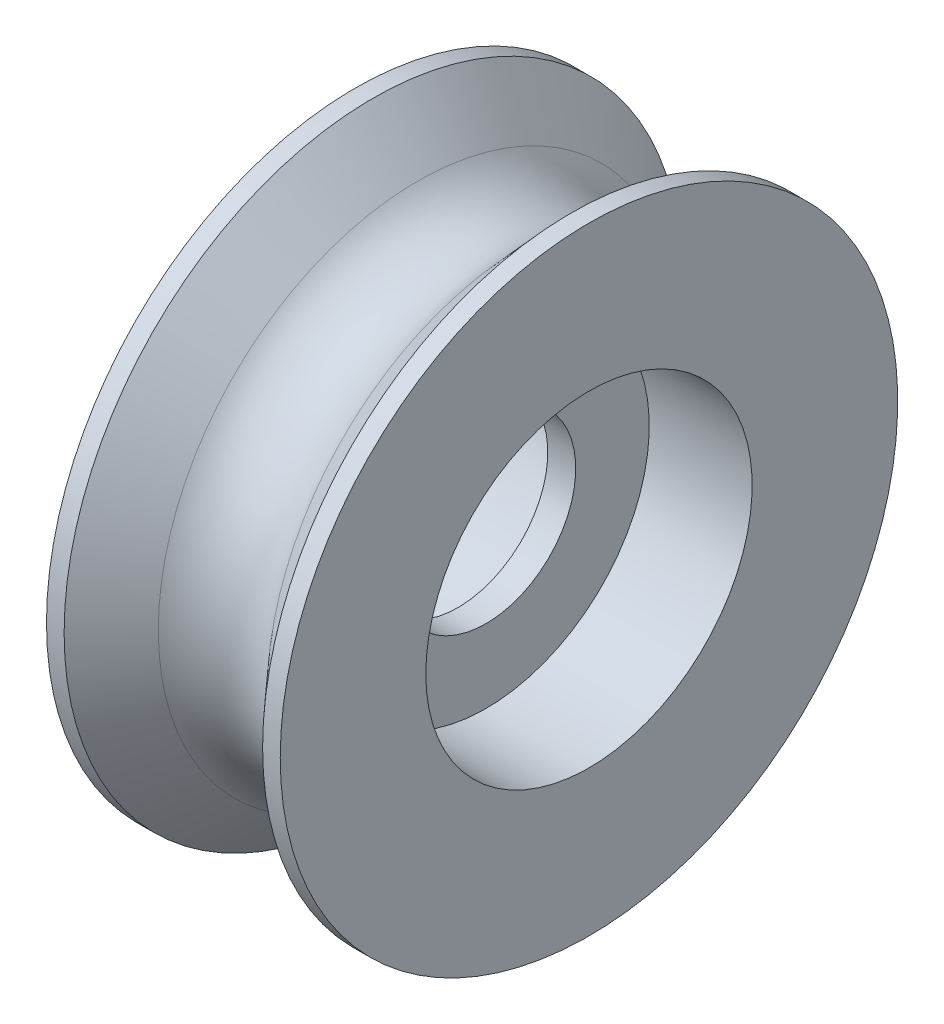
ISO-10303-21;
HEADER;
FILE_DESCRIPTION(('STEP AP214'),'2;1');
FILE_NAME('part.step','',(''),(''),'','','');
FILE_SCHEMA(('AUTOMOTIVE_DESIGN { 1 0 10303 214 1 1 1 1 }'));
ENDSEC;
DATA;
#1=APPLICATION_CONTEXT('core data for automotive mechanical design processes');
#2=APPLICATION_PROTOCOL_DEFINITION('international standard','automotive_design',2000,#1);
#3=PRODUCT_CONTEXT('',#1,'mechanical');
#4=PRODUCT('Part','Part','',(#3));
#5=PRODUCT_RELATED_PRODUCT_CATEGORY('part','',(#4));
#6=PRODUCT_DEFINITION_FORMATION('','',#4);
#7=PRODUCT_DEFINITION_CONTEXT('part definition',#1,'design');
#8=PRODUCT_DEFINITION('design','',#6,#7);
#9=PRODUCT_DEFINITION_SHAPE('','',#8);
#10=(LENGTH_UNIT() NAMED_UNIT(*) SI_UNIT(.MILLI.,.METRE.));
#11=(NAMED_UNIT(*) PLANE_ANGLE_UNIT() SI_UNIT($,.RADIAN.));
#12=(NAMED_UNIT(*) SI_UNIT($,.STERADIAN.) SOLID_ANGLE_UNIT());
#13=UNCERTAINTY_MEASURE_WITH_UNIT(LENGTH_MEASURE(1.E-05),#10,'distance_accuracy_value','');
#14=(GEOMETRIC_REPRESENTATION_CONTEXT(3) GLOBAL_UNCERTAINTY_ASSIGNED_CONTEXT((#13)) GLOBAL_UNIT_ASSIGNED_CONTEXT((#10,
#11,#12)) REPRESENTATION_CONTEXT('',''));
#15=CARTESIAN_POINT('',(0.,0.,0.));
#16=DIRECTION('',(0.,0.,1.));
#17=DIRECTION('',(1.,0.,0.));
#18=AXIS2_PLACEMENT_3D('',#15,#16,#17);
#19=CARTESIAN_POINT('',(-7.95,0.,-21.));
#20=DIRECTION('',(1.,0.,0.));
#21=DIRECTION('',(0.,0.,-1.));
#22=AXIS2_PLACEMENT_3D('',#19,#20,#21);
#23=PLANE('',#22);
#24=CARTESIAN_POINT('',(-7.95,0.,0.));
#25=DIRECTION('',(-1.,0.,0.));
#26=DIRECTION('',(0.,0.,1.));
#27=AXIS2_PLACEMENT_3D('',#24,#25,#26);
#28=CIRCLE('',#27,11.1);
#29=CARTESIAN_POINT('',(-7.95,0.,11.1));
#30=VERTEX_POINT('',#29);
#31=EDGE_CURVE('E10',#30,#30,#28,.T.);
#32=ORIENTED_EDGE('',*,*,#31,.F.);
#33=EDGE_LOOP('',(#32));
#34=FACE_BOUND('',#33,.T.);
#35=CARTESIAN_POINT('',(-7.95,0.,0.));
#36=DIRECTION('',(-1.,0.,0.));
#37=DIRECTION('',(0.,0.,1.));
#38=AXIS2_PLACEMENT_3D('',#35,#36,#37);
#39=CIRCLE('',#38,21.);
#40=CARTESIAN_POINT('',(-7.95,0.,21.));
#41=VERTEX_POINT('',#40);
#42=EDGE_CURVE('E94',#41,#41,#39,.T.);
#43=ORIENTED_EDGE('',*,*,#42,.T.);
#44=EDGE_LOOP('',(#43));
#45=FACE_BOUND('',#44,.T.);
#46=ADVANCED_FACE('F43',(#34,#45),#23,.F.);
#47=CARTESIAN_POINT('',(-3.71581415851021,0.,0.));
#48=DIRECTION('',(-1.,0.,0.));
#49=DIRECTION('',(0.,0.,1.));
#50=AXIS2_PLACEMENT_3D('',#47,#48,#49);
#51=CYLINDRICAL_SURFACE('',#50,11.1);
#52=CARTESIAN_POINT('',(-0.950000000000001,0.,0.));
#53=DIRECTION('',(-1.,0.,0.));
#54=DIRECTION('',(0.,0.,1.));
#55=AXIS2_PLACEMENT_3D('',#52,#53,#54);
#56=CIRCLE('',#55,11.1);
#57=CARTESIAN_POINT('',(-0.950000000000001,0.,11.1));
#58=VERTEX_POINT('',#57);
#59=EDGE_CURVE('E50',#58,#58,#56,.T.);
#60=ORIENTED_EDGE('',*,*,#59,.F.);
#61=EDGE_LOOP('',(#60));
#62=FACE_BOUND('',#61,.T.);
#63=ORIENTED_EDGE('',*,*,#31,.T.);
#64=EDGE_LOOP('',(#63));
#65=FACE_BOUND('',#64,.T.);
#66=ADVANCED_FACE('F156',(#62,#65),#51,.F.);
#67=CARTESIAN_POINT('',(-0.950000000000001,0.,-11.1));
#68=DIRECTION('',(1.,0.,0.));
#69=DIRECTION('',(0.,0.,-1.));
#70=AXIS2_PLACEMENT_3D('',#67,#68,#69);
#71=PLANE('',#70);
#72=CARTESIAN_POINT('',(-0.95,0.,0.));
#73=DIRECTION('',(-1.,0.,0.));
#74=DIRECTION('',(0.,0.,1.));
#75=AXIS2_PLACEMENT_3D('',#72,#73,#74);
#76=CIRCLE('',#75,6.1);
#77=CARTESIAN_POINT('',(-0.95,0.,6.1));
#78=VERTEX_POINT('',#77);
#79=EDGE_CURVE('E55',#78,#78,#76,.T.);
#80=ORIENTED_EDGE('',*,*,#79,.F.);
#81=EDGE_LOOP('',(#80));
#82=FACE_BOUND('',#81,.T.);
#83=ORIENTED_EDGE('',*,*,#59,.T.);
#84=EDGE_LOOP('',(#83));
#85=FACE_BOUND('',#84,.T.);
#86=ADVANCED_FACE('F151',(#82,#85),#71,.F.);
#87=CARTESIAN_POINT('',(-3.71581415851021,0.,0.));
#88=DIRECTION('',(-1.,0.,0.));
#89=DIRECTION('',(0.,0.,1.));
#90=AXIS2_PLACEMENT_3D('',#87,#88,#89);
#91=CYLINDRICAL_SURFACE('',#90,6.1);
#92=CARTESIAN_POINT('',(0.95,0.,0.));
#93=DIRECTION('',(-1.,0.,0.));
#94=DIRECTION('',(0.,0.,1.));
#95=AXIS2_PLACEMENT_3D('',#92,#93,#94);
#96=CIRCLE('',#95,6.1);
#97=CARTESIAN_POINT('',(0.95,0.,6.1));
#98=VERTEX_POINT('',#97);
#99=EDGE_CURVE('E60',#98,#98,#96,.T.);
#100=ORIENTED_EDGE('',*,*,#99,.F.);
#101=EDGE_LOOP('',(#100));
#102=FACE_BOUND('',#101,.T.);
#103=ORIENTED_EDGE('',*,*,#79,.T.);
#104=EDGE_LOOP('',(#103));
#105=FACE_BOUND('',#104,.T.);
#106=ADVANCED_FACE('F145',(#102,#105),#91,.F.);
#107=CARTESIAN_POINT('',(0.95,0.,-6.1));
#108=DIRECTION('',(-1.,0.,0.));
#109=DIRECTION('',(0.,0.,1.));
#110=AXIS2_PLACEMENT_3D('',#107,#108,#109);
#111=PLANE('',#110);
#112=CARTESIAN_POINT('',(0.95,0.,0.));
#113=DIRECTION('',(-1.,0.,0.));
#114=DIRECTION('',(0.,0.,1.));
#115=AXIS2_PLACEMENT_3D('',#112,#113,#114);
#116=CIRCLE('',#115,11.1);
#117=CARTESIAN_POINT('',(0.95,0.,11.1));
#118=VERTEX_POINT('',#117);
#119=EDGE_CURVE('E66',#118,#118,#116,.T.);
#120=ORIENTED_EDGE('',*,*,#119,.F.);
#121=EDGE_LOOP('',(#120));
#122=FACE_BOUND('',#121,.T.);
#123=ORIENTED_EDGE('',*,*,#99,.T.);
#124=EDGE_LOOP('',(#123));
#125=FACE_BOUND('',#124,.T.);
#126=ADVANCED_FACE('F139',(#122,#125),#111,.F.);
#127=CARTESIAN_POINT('',(-3.71581415851021,0.,0.));
#128=DIRECTION('',(-1.,0.,0.));
#129=DIRECTION('',(0.,0.,1.));
#130=AXIS2_PLACEMENT_3D('',#127,#128,#129);
#131=CYLINDRICAL_SURFACE('',#130,11.1);
#132=CARTESIAN_POINT('',(7.95,0.,0.));
#133=DIRECTION('',(-1.,0.,0.));
#134=DIRECTION('',(0.,0.,1.));
#135=AXIS2_PLACEMENT_3D('',#132,#133,#134);
#136=CIRCLE('',#135,11.1);
#137=CARTESIAN_POINT('',(7.95,0.,11.1));
#138=VERTEX_POINT('',#137);
#139=EDGE_CURVE('E70',#138,#138,#136,.T.);
#140=ORIENTED_EDGE('',*,*,#139,.F.);
#141=EDGE_LOOP('',(#140));
#142=FACE_BOUND('',#141,.T.);
#143=ORIENTED_EDGE('',*,*,#119,.T.);
#144=EDGE_LOOP('',(#143));
#145=FACE_BOUND('',#144,.T.);
#146=ADVANCED_FACE('F133',(#142,#145),#131,.F.);
#147=CARTESIAN_POINT('',(7.95,0.,-21.));
#148=DIRECTION('',(-1.,0.,0.));
#149=DIRECTION('',(0.,0.,1.));
#150=AXIS2_PLACEMENT_3D('',#147,#148,#149);
#151=PLANE('',#150);
#152=CARTESIAN_POINT('',(7.95,0.,0.));
#153=DIRECTION('',(-1.,0.,0.));
#154=DIRECTION('',(0.,0.,1.));
#155=AXIS2_PLACEMENT_3D('',#152,#153,#154);
#156=CIRCLE('',#155,21.);
#157=CARTESIAN_POINT('',(7.95,0.,21.));
#158=VERTEX_POINT('',#157);
#159=EDGE_CURVE('E74',#158,#158,#156,.T.);
#160=ORIENTED_EDGE('',*,*,#159,.F.);
#161=EDGE_LOOP('',(#160));
#162=FACE_BOUND('',#161,.T.);
#163=ORIENTED_EDGE('',*,*,#139,.T.);
#164=EDGE_LOOP('',(#163));
#165=FACE_BOUND('',#164,.T.);
#166=ADVANCED_FACE('F127',(#162,#165),#151,.F.);
#167=CARTESIAN_POINT('',(-3.71581415851021,0.,0.));
#168=DIRECTION('',(-1.,0.,0.));
#169=DIRECTION('',(0.,0.,1.));
#170=AXIS2_PLACEMENT_3D('',#167,#168,#169);
#171=CYLINDRICAL_SURFACE('',#170,21.);
#172=CARTESIAN_POINT('',(6.75,0.,0.));
#173=DIRECTION('',(-1.,0.,0.));
#174=DIRECTION('',(0.,0.,1.));
#175=AXIS2_PLACEMENT_3D('',#172,#173,#174);
#176=CIRCLE('',#175,21.);
#177=CARTESIAN_POINT('',(6.75,0.,21.));
#178=VERTEX_POINT('',#177);
#179=EDGE_CURVE('E78',#178,#178,#176,.T.);
#180=ORIENTED_EDGE('',*,*,#179,.F.);
#181=EDGE_LOOP('',(#180));
#182=FACE_BOUND('',#181,.T.);
#183=ORIENTED_EDGE('',*,*,#159,.T.);
#184=EDGE_LOOP('',(#183));
#185=FACE_BOUND('',#184,.T.);
#186=ADVANCED_FACE('F121',(#182,#185),#171,.T.);
#187=CARTESIAN_POINT('',(6.75,0.,0.));
#188=DIRECTION('',(1.,0.,0.));
#189=DIRECTION('',(0.,0.,-1.));
#190=AXIS2_PLACEMENT_3D('',#187,#188,#189);
#191=CONICAL_SURFACE('',#190,21.,0.834172324775768);
#192=CARTESIAN_POINT('',(3.7037037037037,0.,0.));
#193=DIRECTION('',(-1.,0.,0.));
#194=DIRECTION('',(0.,0.,1.));
#195=AXIS2_PLACEMENT_3D('',#192,#193,#194);
#196=CIRCLE('',#195,17.6410449727376);
#197=CARTESIAN_POINT('',(3.7037037037037,0.,17.6410449727376));
#198=VERTEX_POINT('',#197);
#199=EDGE_CURVE('E82',#198,#198,#196,.T.);
#200=ORIENTED_EDGE('',*,*,#199,.F.);
#201=EDGE_LOOP('',(#200));
#202=FACE_BOUND('',#201,.T.);
#203=ORIENTED_EDGE('',*,*,#179,.T.);
#204=EDGE_LOOP('',(#203));
#205=FACE_BOUND('',#204,.T.);
#206=ADVANCED_FACE('F115',(#202,#205),#191,.T.);
#207=CARTESIAN_POINT('',(0.,0.,0.));
#208=DIRECTION('',(-1.,0.,0.));
#209=DIRECTION('',(0.,0.,1.));
#210=AXIS2_PLACEMENT_3D('',#207,#208,#209);
#211=TOROIDAL_SURFACE('',#210,21.,5.);
#212=CARTESIAN_POINT('',(-3.7037037037037,0.,0.));
#213=DIRECTION('',(-1.,0.,0.));
#214=DIRECTION('',(0.,0.,1.));
#215=AXIS2_PLACEMENT_3D('',#212,#213,#214);
#216=CIRCLE('',#215,17.6410449727376);
#217=CARTESIAN_POINT('',(-3.7037037037037,0.,17.6410449727376));
#218=VERTEX_POINT('',#217);
#219=EDGE_CURVE('E86',#218,#218,#216,.T.);
#220=ORIENTED_EDGE('',*,*,#219,.F.);
#221=EDGE_LOOP('',(#220));
#222=FACE_BOUND('',#221,.T.);
#223=ORIENTED_EDGE('',*,*,#199,.T.);
#224=EDGE_LOOP('',(#223));
#225=FACE_BOUND('',#224,.T.);
#226=ADVANCED_FACE('F109',(#222,#225),#211,.F.);
#227=CARTESIAN_POINT('',(-3.7037037037037,0.,0.));
#228=DIRECTION('',(-1.,0.,0.));
#229=DIRECTION('',(0.,0.,1.));
#230=AXIS2_PLACEMENT_3D('',#227,#228,#229);
#231=CONICAL_SURFACE('',#230,17.6410449727376,0.834172324775768);
#232=CARTESIAN_POINT('',(-6.75,0.,0.));
#233=DIRECTION('',(-1.,0.,0.));
#234=DIRECTION('',(0.,0.,1.));
#235=AXIS2_PLACEMENT_3D('',#232,#233,#234);
#236=CIRCLE('',#235,21.);
#237=CARTESIAN_POINT('',(-6.75,0.,21.));
#238=VERTEX_POINT('',#237);
#239=EDGE_CURVE('E90',#238,#238,#236,.T.);
#240=ORIENTED_EDGE('',*,*,#239,.F.);
#241=EDGE_LOOP('',(#240));
#242=FACE_BOUND('',#241,.T.);
#243=ORIENTED_EDGE('',*,*,#219,.T.);
#244=EDGE_LOOP('',(#243));
#245=FACE_BOUND('',#244,.T.);
#246=ADVANCED_FACE('F103',(#242,#245),#231,.T.);
#247=CARTESIAN_POINT('',(-3.71581415851021,0.,0.));
#248=DIRECTION('',(-1.,0.,0.));
#249=DIRECTION('',(0.,0.,1.));
#250=AXIS2_PLACEMENT_3D('',#247,#248,#249);
#251=CYLINDRICAL_SURFACE('',#250,21.);
#252=ORIENTED_EDGE('',*,*,#42,.F.);
#253=EDGE_LOOP('',(#252));
#254=FACE_BOUND('',#253,.T.);
#255=ORIENTED_EDGE('',*,*,#239,.T.);
#256=EDGE_LOOP('',(#255));
#257=FACE_BOUND('',#256,.T.);
#258=ADVANCED_FACE('F100',(#254,#257),#251,.T.);
#259=CLOSED_SHELL('',(#46,#66,#86,#106,#126,#146,#166,#186,#206,#226,#246,#258));
#260=MANIFOLD_SOLID_BREP('B2',#259);
#261=ADVANCED_BREP_SHAPE_REPRESENTATION('',(#18,#260),#14);
#262=SHAPE_DEFINITION_REPRESENTATION(#9,#261);
ENDSEC;
END-ISO-10303-21;
